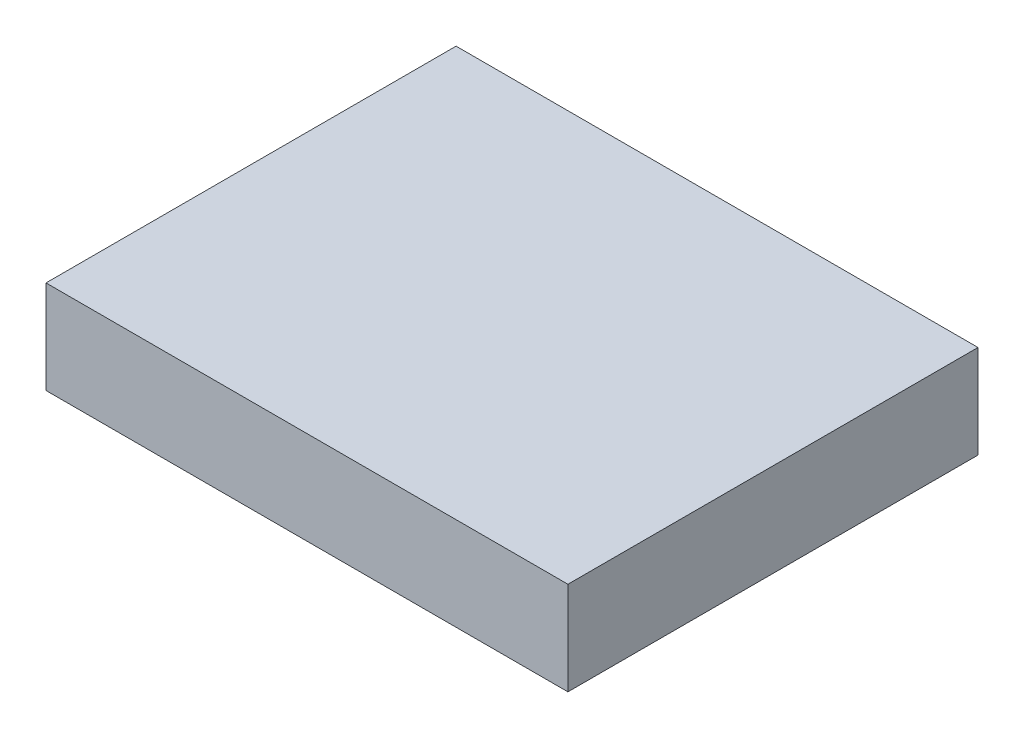
ISO-10303-21;
HEADER;
FILE_DESCRIPTION(('STEP AP214'),'2;1');
FILE_NAME('part.step','',(''),(''),'','','');
FILE_SCHEMA(('AUTOMOTIVE_DESIGN { 1 0 10303 214 1 1 1 1 }'));
ENDSEC;
DATA;
#1=APPLICATION_CONTEXT('core data for automotive mechanical design processes');
#2=APPLICATION_PROTOCOL_DEFINITION('international standard','automotive_design',2000,#1);
#3=PRODUCT_CONTEXT('',#1,'mechanical');
#4=PRODUCT('Part','Part','',(#3));
#5=PRODUCT_RELATED_PRODUCT_CATEGORY('part','',(#4));
#6=PRODUCT_DEFINITION_FORMATION('','',#4);
#7=PRODUCT_DEFINITION_CONTEXT('part definition',#1,'design');
#8=PRODUCT_DEFINITION('design','',#6,#7);
#9=PRODUCT_DEFINITION_SHAPE('','',#8);
#10=(LENGTH_UNIT() NAMED_UNIT(*) SI_UNIT(.MILLI.,.METRE.));
#11=(NAMED_UNIT(*) PLANE_ANGLE_UNIT() SI_UNIT($,.RADIAN.));
#12=(NAMED_UNIT(*) SI_UNIT($,.STERADIAN.) SOLID_ANGLE_UNIT());
#13=UNCERTAINTY_MEASURE_WITH_UNIT(LENGTH_MEASURE(1.E-05),#10,'distance_accuracy_value','');
#14=(GEOMETRIC_REPRESENTATION_CONTEXT(3) GLOBAL_UNCERTAINTY_ASSIGNED_CONTEXT((#13)) GLOBAL_UNIT_ASSIGNED_CONTEXT((#10,
#11,#12)) REPRESENTATION_CONTEXT('',''));
#15=CARTESIAN_POINT('',(0.,0.,0.));
#16=DIRECTION('',(0.,0.,1.));
#17=DIRECTION('',(1.,0.,0.));
#18=AXIS2_PLACEMENT_3D('',#15,#16,#17);
#19=CARTESIAN_POINT('',(355.6,127.,279.4));
#20=DIRECTION('',(-1.,0.,0.));
#21=DIRECTION('',(0.,0.,1.));
#22=AXIS2_PLACEMENT_3D('',#19,#20,#21);
#23=PLANE('',#22);
#24=DIRECTION('',(0.,0.,-1.));
#25=VECTOR('',#24,1.);
#26=CARTESIAN_POINT('',(355.6,0.,279.4));
#27=LINE('',#26,#25);
#28=CARTESIAN_POINT('',(355.6,0.,279.4));
#29=VERTEX_POINT('',#28);
#30=CARTESIAN_POINT('',(355.6,0.,-279.4));
#31=VERTEX_POINT('',#30);
#32=EDGE_CURVE('E96',#29,#31,#27,.T.);
#33=ORIENTED_EDGE('',*,*,#32,.T.);
#34=DIRECTION('',(0.,-1.,0.));
#35=VECTOR('',#34,1.);
#36=CARTESIAN_POINT('',(355.6,127.,-279.4));
#37=LINE('',#36,#35);
#38=CARTESIAN_POINT('',(355.6,127.,-279.4));
#39=VERTEX_POINT('',#38);
#40=EDGE_CURVE('E11',#39,#31,#37,.T.);
#41=ORIENTED_EDGE('',*,*,#40,.F.);
#42=DIRECTION('',(0.,0.,-1.));
#43=VECTOR('',#42,1.);
#44=CARTESIAN_POINT('',(355.6,127.,279.4));
#45=LINE('',#44,#43);
#46=CARTESIAN_POINT('',(355.6,127.,279.4));
#47=VERTEX_POINT('',#46);
#48=EDGE_CURVE('E84',#47,#39,#45,.T.);
#49=ORIENTED_EDGE('',*,*,#48,.F.);
#50=DIRECTION('',(0.,-1.,0.));
#51=VECTOR('',#50,1.);
#52=CARTESIAN_POINT('',(355.6,127.,279.4));
#53=LINE('',#52,#51);
#54=EDGE_CURVE('E92',#47,#29,#53,.T.);
#55=ORIENTED_EDGE('',*,*,#54,.T.);
#56=EDGE_LOOP('',(#33,#41,#49,#55));
#57=FACE_BOUND('',#56,.T.);
#58=ADVANCED_FACE('F33',(#57),#23,.F.);
#59=CARTESIAN_POINT('',(-355.6,127.,-279.4));
#60=DIRECTION('',(0.,0.,1.));
#61=DIRECTION('',(1.,0.,0.));
#62=AXIS2_PLACEMENT_3D('',#59,#60,#61);
#63=PLANE('',#62);
#64=DIRECTION('',(-1.,0.,0.));
#65=VECTOR('',#64,1.);
#66=CARTESIAN_POINT('',(-355.6,0.,-279.4));
#67=LINE('',#66,#65);
#68=CARTESIAN_POINT('',(-355.6,0.,-279.4));
#69=VERTEX_POINT('',#68);
#70=EDGE_CURVE('E88',#31,#69,#67,.T.);
#71=ORIENTED_EDGE('',*,*,#70,.T.);
#72=DIRECTION('',(0.,-1.,0.));
#73=VECTOR('',#72,1.);
#74=CARTESIAN_POINT('',(-355.6,127.,-279.4));
#75=LINE('',#74,#73);
#76=CARTESIAN_POINT('',(-355.6,127.,-279.4));
#77=VERTEX_POINT('',#76);
#78=EDGE_CURVE('E41',#77,#69,#75,.T.);
#79=ORIENTED_EDGE('',*,*,#78,.F.);
#80=DIRECTION('',(-1.,0.,0.));
#81=VECTOR('',#80,1.);
#82=CARTESIAN_POINT('',(-355.6,127.,-279.4));
#83=LINE('',#82,#81);
#84=EDGE_CURVE('E79',#39,#77,#83,.T.);
#85=ORIENTED_EDGE('',*,*,#84,.F.);
#86=ORIENTED_EDGE('',*,*,#40,.T.);
#87=EDGE_LOOP('',(#71,#79,#85,#86));
#88=FACE_BOUND('',#87,.T.);
#89=ADVANCED_FACE('F87',(#88),#63,.F.);
#90=CARTESIAN_POINT('',(-355.6,127.,279.4));
#91=DIRECTION('',(1.,0.,0.));
#92=DIRECTION('',(0.,0.,-1.));
#93=AXIS2_PLACEMENT_3D('',#90,#91,#92);
#94=PLANE('',#93);
#95=DIRECTION('',(0.,0.,1.));
#96=VECTOR('',#95,1.);
#97=CARTESIAN_POINT('',(-355.6,0.,279.4));
#98=LINE('',#97,#96);
#99=CARTESIAN_POINT('',(-355.6,0.,279.4));
#100=VERTEX_POINT('',#99);
#101=EDGE_CURVE('E66',#69,#100,#98,.T.);
#102=ORIENTED_EDGE('',*,*,#101,.T.);
#103=DIRECTION('',(0.,-1.,0.));
#104=VECTOR('',#103,1.);
#105=CARTESIAN_POINT('',(-355.6,127.,279.4));
#106=LINE('',#105,#104);
#107=CARTESIAN_POINT('',(-355.6,127.,279.4));
#108=VERTEX_POINT('',#107);
#109=EDGE_CURVE('E89',#108,#100,#106,.T.);
#110=ORIENTED_EDGE('',*,*,#109,.F.);
#111=DIRECTION('',(0.,0.,1.));
#112=VECTOR('',#111,1.);
#113=CARTESIAN_POINT('',(-355.6,127.,279.4));
#114=LINE('',#113,#112);
#115=EDGE_CURVE('E82',#77,#108,#114,.T.);
#116=ORIENTED_EDGE('',*,*,#115,.F.);
#117=ORIENTED_EDGE('',*,*,#78,.T.);
#118=EDGE_LOOP('',(#102,#110,#116,#117));
#119=FACE_BOUND('',#118,.T.);
#120=ADVANCED_FACE('F90',(#119),#94,.F.);
#121=CARTESIAN_POINT('',(-355.6,127.,279.4));
#122=DIRECTION('',(0.,0.,-1.));
#123=DIRECTION('',(-1.,0.,0.));
#124=AXIS2_PLACEMENT_3D('',#121,#122,#123);
#125=PLANE('',#124);
#126=DIRECTION('',(1.,0.,0.));
#127=VECTOR('',#126,1.);
#128=CARTESIAN_POINT('',(-355.6,0.,279.4));
#129=LINE('',#128,#127);
#130=EDGE_CURVE('E72',#100,#29,#129,.T.);
#131=ORIENTED_EDGE('',*,*,#130,.T.);
#132=ORIENTED_EDGE('',*,*,#54,.F.);
#133=DIRECTION('',(1.,0.,0.));
#134=VECTOR('',#133,1.);
#135=CARTESIAN_POINT('',(-355.6,127.,279.4));
#136=LINE('',#135,#134);
#137=EDGE_CURVE('E49',#108,#47,#136,.T.);
#138=ORIENTED_EDGE('',*,*,#137,.F.);
#139=ORIENTED_EDGE('',*,*,#109,.T.);
#140=EDGE_LOOP('',(#131,#132,#138,#139));
#141=FACE_BOUND('',#140,.T.);
#142=ADVANCED_FACE('F103',(#141),#125,.F.);
#143=CARTESIAN_POINT('',(0.,127.,0.));
#144=DIRECTION('',(0.,-1.,0.));
#145=DIRECTION('',(0.,0.,-1.));
#146=AXIS2_PLACEMENT_3D('',#143,#144,#145);
#147=PLANE('',#146);
#148=ORIENTED_EDGE('',*,*,#48,.T.);
#149=ORIENTED_EDGE('',*,*,#84,.T.);
#150=ORIENTED_EDGE('',*,*,#115,.T.);
#151=ORIENTED_EDGE('',*,*,#137,.T.);
#152=EDGE_LOOP('',(#148,#149,#150,#151));
#153=FACE_BOUND('',#152,.T.);
#154=ADVANCED_FACE('F80',(#153),#147,.F.);
#155=CARTESIAN_POINT('',(0.,0.,0.));
#156=DIRECTION('',(0.,-1.,0.));
#157=DIRECTION('',(0.,0.,-1.));
#158=AXIS2_PLACEMENT_3D('',#155,#156,#157);
#159=PLANE('',#158);
#160=ORIENTED_EDGE('',*,*,#32,.F.);
#161=ORIENTED_EDGE('',*,*,#130,.F.);
#162=ORIENTED_EDGE('',*,*,#101,.F.);
#163=ORIENTED_EDGE('',*,*,#70,.F.);
#164=EDGE_LOOP('',(#160,#161,#162,#163));
#165=FACE_BOUND('',#164,.T.);
#166=ADVANCED_FACE('F106',(#165),#159,.T.);
#167=CLOSED_SHELL('',(#58,#89,#120,#142,#154,#166));
#168=MANIFOLD_SOLID_BREP('B2',#167);
#169=ADVANCED_BREP_SHAPE_REPRESENTATION('',(#18,#168),#14);
#170=SHAPE_DEFINITION_REPRESENTATION(#9,#169);
ENDSEC;
END-ISO-10303-21;
